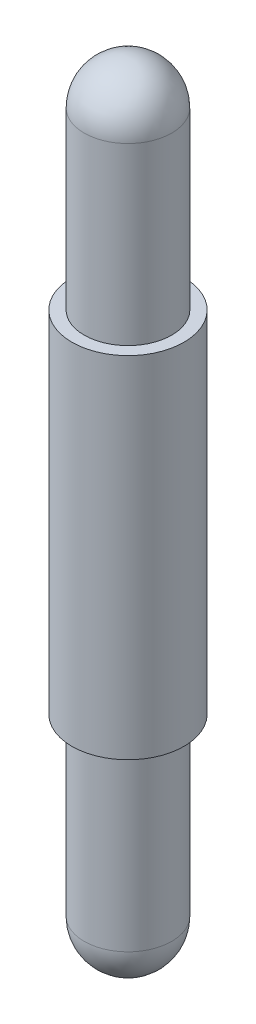
ISO-10303-21;
HEADER;
FILE_DESCRIPTION(('STEP AP214'),'2;1');
FILE_NAME('part.step','',(''),(''),'','','');
FILE_SCHEMA(('AUTOMOTIVE_DESIGN { 1 0 10303 214 1 1 1 1 }'));
ENDSEC;
DATA;
#1=APPLICATION_CONTEXT('core data for automotive mechanical design processes');
#2=APPLICATION_PROTOCOL_DEFINITION('international standard','automotive_design',2000,#1);
#3=PRODUCT_CONTEXT('',#1,'mechanical');
#4=PRODUCT('Part','Part','',(#3));
#5=PRODUCT_RELATED_PRODUCT_CATEGORY('part','',(#4));
#6=PRODUCT_DEFINITION_FORMATION('','',#4);
#7=PRODUCT_DEFINITION_CONTEXT('part definition',#1,'design');
#8=PRODUCT_DEFINITION('design','',#6,#7);
#9=PRODUCT_DEFINITION_SHAPE('','',#8);
#10=(LENGTH_UNIT() NAMED_UNIT(*) SI_UNIT(.MILLI.,.METRE.));
#11=(NAMED_UNIT(*) PLANE_ANGLE_UNIT() SI_UNIT($,.RADIAN.));
#12=(NAMED_UNIT(*) SI_UNIT($,.STERADIAN.) SOLID_ANGLE_UNIT());
#13=UNCERTAINTY_MEASURE_WITH_UNIT(LENGTH_MEASURE(1.E-05),#10,'distance_accuracy_value','');
#14=(GEOMETRIC_REPRESENTATION_CONTEXT(3) GLOBAL_UNCERTAINTY_ASSIGNED_CONTEXT((#13)) GLOBAL_UNIT_ASSIGNED_CONTEXT((#10,
#11,#12)) REPRESENTATION_CONTEXT('',''));
#15=CARTESIAN_POINT('',(0.,0.,0.));
#16=DIRECTION('',(0.,0.,1.));
#17=DIRECTION('',(1.,0.,0.));
#18=AXIS2_PLACEMENT_3D('',#15,#16,#17);
#19=CARTESIAN_POINT('',(0.,86.4917604172456,0.));
#20=DIRECTION('',(0.,1.,0.));
#21=DIRECTION('',(0.,0.,1.));
#22=AXIS2_PLACEMENT_3D('',#19,#20,#21);
#23=CYLINDRICAL_SURFACE('',#22,12.5);
#24=CARTESIAN_POINT('',(0.,23.9917604172456,0.));
#25=DIRECTION('',(0.,1.,0.));
#26=DIRECTION('',(0.,0.,1.));
#27=AXIS2_PLACEMENT_3D('',#24,#25,#26);
#28=CIRCLE('',#27,12.5);
#29=CARTESIAN_POINT('',(0.,23.9917604172456,12.5));
#30=VERTEX_POINT('',#29);
#31=EDGE_CURVE('E55',#30,#30,#28,.T.);
#32=ORIENTED_EDGE('',*,*,#31,.T.);
#33=EDGE_LOOP('',(#32));
#34=FACE_BOUND('',#33,.T.);
#35=CARTESIAN_POINT('',(0.,73.9917604172456,0.));
#36=DIRECTION('',(0.,1.,0.));
#37=DIRECTION('',(0.,0.,1.));
#38=AXIS2_PLACEMENT_3D('',#35,#36,#37);
#39=CIRCLE('',#38,12.5);
#40=CARTESIAN_POINT('',(0.,73.9917604172456,12.5));
#41=VERTEX_POINT('',#40);
#42=EDGE_CURVE('E10',#41,#41,#39,.T.);
#43=ORIENTED_EDGE('',*,*,#42,.F.);
#44=EDGE_LOOP('',(#43));
#45=FACE_BOUND('',#44,.T.);
#46=ADVANCED_FACE('F33',(#34,#45),#23,.T.);
#47=CARTESIAN_POINT('',(0.,73.9917604172456,0.));
#48=DIRECTION('',(0.,1.,0.));
#49=DIRECTION('',(1.,0.,0.));
#50=AXIS2_PLACEMENT_3D('',#47,#48,#49);
#51=SPHERICAL_SURFACE('',#50,12.5);
#52=ORIENTED_EDGE('',*,*,#42,.T.);
#53=EDGE_LOOP('',(#52));
#54=FACE_BOUND('',#53,.T.);
#55=ADVANCED_FACE('F73',(#54),#51,.T.);
#56=CARTESIAN_POINT('',(0.,-126.008239582754,0.));
#57=DIRECTION('',(0.,1.,0.));
#58=DIRECTION('',(-1.,0.,0.));
#59=AXIS2_PLACEMENT_3D('',#56,#57,#58);
#60=SPHERICAL_SURFACE('',#59,12.5);
#61=CARTESIAN_POINT('',(0.,-126.008239582754,0.));
#62=DIRECTION('',(0.,1.,0.));
#63=DIRECTION('',(0.,0.,1.));
#64=AXIS2_PLACEMENT_3D('',#61,#62,#63);
#65=CIRCLE('',#64,12.5);
#66=CARTESIAN_POINT('',(0.,-126.008239582754,12.5));
#67=VERTEX_POINT('',#66);
#68=EDGE_CURVE('E39',#67,#67,#65,.T.);
#69=ORIENTED_EDGE('',*,*,#68,.F.);
#70=EDGE_LOOP('',(#69));
#71=FACE_BOUND('',#70,.T.);
#72=ADVANCED_FACE('F77',(#71),#60,.T.);
#73=CARTESIAN_POINT('',(0.,86.4917604172456,0.));
#74=DIRECTION('',(0.,1.,0.));
#75=DIRECTION('',(0.,0.,1.));
#76=AXIS2_PLACEMENT_3D('',#73,#74,#75);
#77=CYLINDRICAL_SURFACE('',#76,12.5);
#78=ORIENTED_EDGE('',*,*,#68,.T.);
#79=EDGE_LOOP('',(#78));
#80=FACE_BOUND('',#79,.T.);
#81=CARTESIAN_POINT('',(0.,-76.0082395827544,0.));
#82=DIRECTION('',(0.,1.,0.));
#83=DIRECTION('',(0.,0.,1.));
#84=AXIS2_PLACEMENT_3D('',#81,#82,#83);
#85=CIRCLE('',#84,12.5);
#86=CARTESIAN_POINT('',(0.,-76.0082395827544,12.5));
#87=VERTEX_POINT('',#86);
#88=EDGE_CURVE('E43',#87,#87,#85,.T.);
#89=ORIENTED_EDGE('',*,*,#88,.F.);
#90=EDGE_LOOP('',(#89));
#91=FACE_BOUND('',#90,.T.);
#92=ADVANCED_FACE('F81',(#80,#91),#77,.T.);
#93=CARTESIAN_POINT('',(0.,-76.0082395827544,0.));
#94=DIRECTION('',(0.,-1.,0.));
#95=DIRECTION('',(0.,0.,-1.));
#96=AXIS2_PLACEMENT_3D('',#93,#94,#95);
#97=PLANE('',#96);
#98=ORIENTED_EDGE('',*,*,#88,.T.);
#99=EDGE_LOOP('',(#98));
#100=FACE_BOUND('',#99,.T.);
#101=CARTESIAN_POINT('',(0.,-76.0082395827544,0.));
#102=DIRECTION('',(0.,1.,0.));
#103=DIRECTION('',(0.,0.,1.));
#104=AXIS2_PLACEMENT_3D('',#101,#102,#103);
#105=CIRCLE('',#104,16.);
#106=CARTESIAN_POINT('',(0.,-76.0082395827544,16.));
#107=VERTEX_POINT('',#106);
#108=EDGE_CURVE('E47',#107,#107,#105,.T.);
#109=ORIENTED_EDGE('',*,*,#108,.F.);
#110=EDGE_LOOP('',(#109));
#111=FACE_BOUND('',#110,.T.);
#112=ADVANCED_FACE('F69',(#100,#111),#97,.T.);
#113=CARTESIAN_POINT('',(0.,86.4917604172456,0.));
#114=DIRECTION('',(0.,1.,0.));
#115=DIRECTION('',(0.,0.,1.));
#116=AXIS2_PLACEMENT_3D('',#113,#114,#115);
#117=CYLINDRICAL_SURFACE('',#116,16.);
#118=ORIENTED_EDGE('',*,*,#108,.T.);
#119=EDGE_LOOP('',(#118));
#120=FACE_BOUND('',#119,.T.);
#121=CARTESIAN_POINT('',(0.,23.9917604172456,0.));
#122=DIRECTION('',(0.,1.,0.));
#123=DIRECTION('',(0.,0.,1.));
#124=AXIS2_PLACEMENT_3D('',#121,#122,#123);
#125=CIRCLE('',#124,16.);
#126=CARTESIAN_POINT('',(0.,23.9917604172456,16.));
#127=VERTEX_POINT('',#126);
#128=EDGE_CURVE('E52',#127,#127,#125,.T.);
#129=ORIENTED_EDGE('',*,*,#128,.F.);
#130=EDGE_LOOP('',(#129));
#131=FACE_BOUND('',#130,.T.);
#132=ADVANCED_FACE('F63',(#120,#131),#117,.T.);
#133=CARTESIAN_POINT('',(0.,23.9917604172456,0.));
#134=DIRECTION('',(0.,1.,0.));
#135=DIRECTION('',(0.,0.,1.));
#136=AXIS2_PLACEMENT_3D('',#133,#134,#135);
#137=PLANE('',#136);
#138=ORIENTED_EDGE('',*,*,#128,.T.);
#139=EDGE_LOOP('',(#138));
#140=FACE_BOUND('',#139,.T.);
#141=ORIENTED_EDGE('',*,*,#31,.F.);
#142=EDGE_LOOP('',(#141));
#143=FACE_BOUND('',#142,.T.);
#144=ADVANCED_FACE('F61',(#140,#143),#137,.T.);
#145=CLOSED_SHELL('',(#46,#55,#72,#92,#112,#132,#144));
#146=MANIFOLD_SOLID_BREP('B2',#145);
#147=ADVANCED_BREP_SHAPE_REPRESENTATION('',(#18,#146),#14);
#148=SHAPE_DEFINITION_REPRESENTATION(#9,#147);
ENDSEC;
END-ISO-10303-21;
